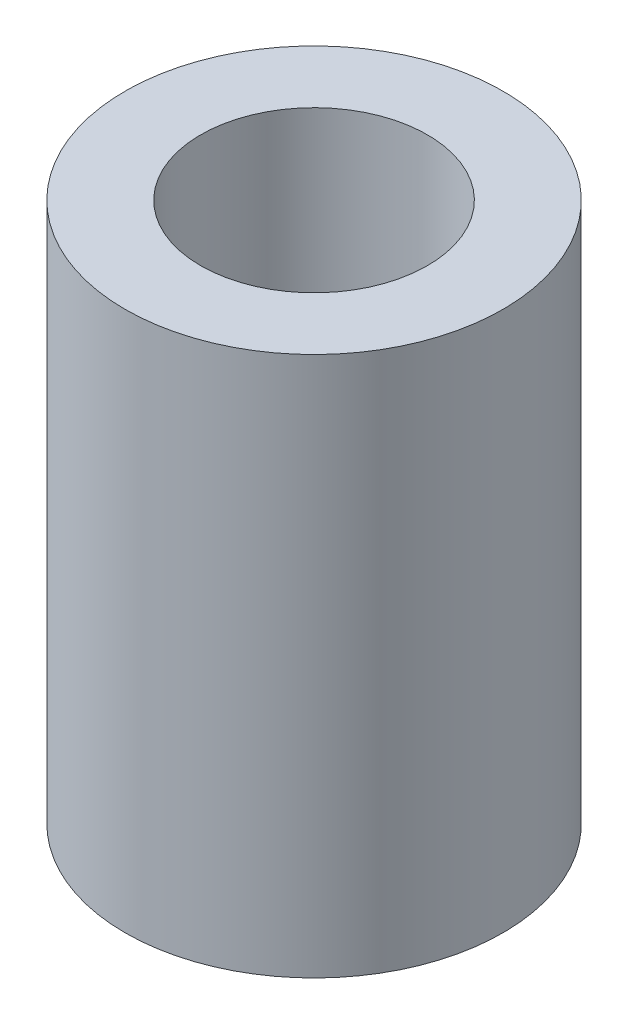
ISO-10303-21;
HEADER;
FILE_DESCRIPTION(('STEP AP214'),'2;1');
FILE_NAME('part.step','',(''),(''),'','','');
FILE_SCHEMA(('AUTOMOTIVE_DESIGN { 1 0 10303 214 1 1 1 1 }'));
ENDSEC;
DATA;
#1=APPLICATION_CONTEXT('core data for automotive mechanical design processes');
#2=APPLICATION_PROTOCOL_DEFINITION('international standard','automotive_design',2000,#1);
#3=PRODUCT_CONTEXT('',#1,'mechanical');
#4=PRODUCT('Part','Part','',(#3));
#5=PRODUCT_RELATED_PRODUCT_CATEGORY('part','',(#4));
#6=PRODUCT_DEFINITION_FORMATION('','',#4);
#7=PRODUCT_DEFINITION_CONTEXT('part definition',#1,'design');
#8=PRODUCT_DEFINITION('design','',#6,#7);
#9=PRODUCT_DEFINITION_SHAPE('','',#8);
#10=(LENGTH_UNIT() NAMED_UNIT(*) SI_UNIT(.MILLI.,.METRE.));
#11=(NAMED_UNIT(*) PLANE_ANGLE_UNIT() SI_UNIT($,.RADIAN.));
#12=(NAMED_UNIT(*) SI_UNIT($,.STERADIAN.) SOLID_ANGLE_UNIT());
#13=UNCERTAINTY_MEASURE_WITH_UNIT(LENGTH_MEASURE(1.E-05),#10,'distance_accuracy_value','');
#14=(GEOMETRIC_REPRESENTATION_CONTEXT(3) GLOBAL_UNCERTAINTY_ASSIGNED_CONTEXT((#13)) GLOBAL_UNIT_ASSIGNED_CONTEXT((#10,
#11,#12)) REPRESENTATION_CONTEXT('',''));
#15=CARTESIAN_POINT('',(0.,0.,0.));
#16=DIRECTION('',(0.,0.,1.));
#17=DIRECTION('',(1.,0.,0.));
#18=AXIS2_PLACEMENT_3D('',#15,#16,#17);
#19=CARTESIAN_POINT('',(0.,10.,0.));
#20=DIRECTION('',(0.,1.,0.));
#21=DIRECTION('',(0.,0.,1.));
#22=AXIS2_PLACEMENT_3D('',#19,#20,#21);
#23=PLANE('',#22);
#24=CARTESIAN_POINT('',(0.,10.,0.));
#25=DIRECTION('',(0.,1.,0.));
#26=DIRECTION('',(0.,0.,1.));
#27=AXIS2_PLACEMENT_3D('',#24,#25,#26);
#28=CIRCLE('',#27,3.5);
#29=CARTESIAN_POINT('',(0.,10.,3.5));
#30=VERTEX_POINT('',#29);
#31=EDGE_CURVE('E10',#30,#30,#28,.T.);
#32=ORIENTED_EDGE('',*,*,#31,.T.);
#33=EDGE_LOOP('',(#32));
#34=FACE_BOUND('',#33,.T.);
#35=CARTESIAN_POINT('',(0.,10.,0.));
#36=DIRECTION('',(0.,1.,0.));
#37=DIRECTION('',(0.,0.,1.));
#38=AXIS2_PLACEMENT_3D('',#35,#36,#37);
#39=CIRCLE('',#38,2.1);
#40=CARTESIAN_POINT('',(0.,10.,2.1));
#41=VERTEX_POINT('',#40);
#42=EDGE_CURVE('E50',#41,#41,#39,.T.);
#43=ORIENTED_EDGE('',*,*,#42,.F.);
#44=EDGE_LOOP('',(#43));
#45=FACE_BOUND('',#44,.T.);
#46=ADVANCED_FACE('F39',(#34,#45),#23,.T.);
#47=CARTESIAN_POINT('',(0.,0.,0.));
#48=DIRECTION('',(0.,1.,0.));
#49=DIRECTION('',(0.,0.,1.));
#50=AXIS2_PLACEMENT_3D('',#47,#48,#49);
#51=PLANE('',#50);
#52=CARTESIAN_POINT('',(0.,0.,0.));
#53=DIRECTION('',(0.,1.,0.));
#54=DIRECTION('',(0.,0.,1.));
#55=AXIS2_PLACEMENT_3D('',#52,#53,#54);
#56=CIRCLE('',#55,3.5);
#57=CARTESIAN_POINT('',(0.,0.,3.5));
#58=VERTEX_POINT('',#57);
#59=EDGE_CURVE('E43',#58,#58,#56,.T.);
#60=ORIENTED_EDGE('',*,*,#59,.F.);
#61=EDGE_LOOP('',(#60));
#62=FACE_BOUND('',#61,.T.);
#63=CARTESIAN_POINT('',(0.,0.,0.));
#64=DIRECTION('',(0.,1.,0.));
#65=DIRECTION('',(0.,0.,1.));
#66=AXIS2_PLACEMENT_3D('',#63,#64,#65);
#67=CIRCLE('',#66,2.1);
#68=CARTESIAN_POINT('',(0.,0.,2.1));
#69=VERTEX_POINT('',#68);
#70=EDGE_CURVE('E52',#69,#69,#67,.T.);
#71=ORIENTED_EDGE('',*,*,#70,.T.);
#72=EDGE_LOOP('',(#71));
#73=FACE_BOUND('',#72,.T.);
#74=ADVANCED_FACE('F62',(#62,#73),#51,.F.);
#75=CARTESIAN_POINT('',(0.,10.,0.));
#76=DIRECTION('',(0.,-1.,0.));
#77=DIRECTION('',(0.,0.,-1.));
#78=AXIS2_PLACEMENT_3D('',#75,#76,#77);
#79=CYLINDRICAL_SURFACE('',#78,3.5);
#80=ORIENTED_EDGE('',*,*,#31,.F.);
#81=EDGE_LOOP('',(#80));
#82=FACE_BOUND('',#81,.T.);
#83=ORIENTED_EDGE('',*,*,#59,.T.);
#84=EDGE_LOOP('',(#83));
#85=FACE_BOUND('',#84,.T.);
#86=ADVANCED_FACE('F41',(#82,#85),#79,.T.);
#87=CARTESIAN_POINT('',(0.,10.,0.));
#88=DIRECTION('',(0.,-1.,0.));
#89=DIRECTION('',(0.,0.,-1.));
#90=AXIS2_PLACEMENT_3D('',#87,#88,#89);
#91=CYLINDRICAL_SURFACE('',#90,2.1);
#92=ORIENTED_EDGE('',*,*,#42,.T.);
#93=EDGE_LOOP('',(#92));
#94=FACE_BOUND('',#93,.T.);
#95=ORIENTED_EDGE('',*,*,#70,.F.);
#96=EDGE_LOOP('',(#95));
#97=FACE_BOUND('',#96,.T.);
#98=ADVANCED_FACE('F58',(#94,#97),#91,.F.);
#99=CLOSED_SHELL('',(#46,#74,#86,#98));
#100=MANIFOLD_SOLID_BREP('B2',#99);
#101=ADVANCED_BREP_SHAPE_REPRESENTATION('',(#18,#100),#14);
#102=SHAPE_DEFINITION_REPRESENTATION(#9,#101);
ENDSEC;
END-ISO-10303-21;
